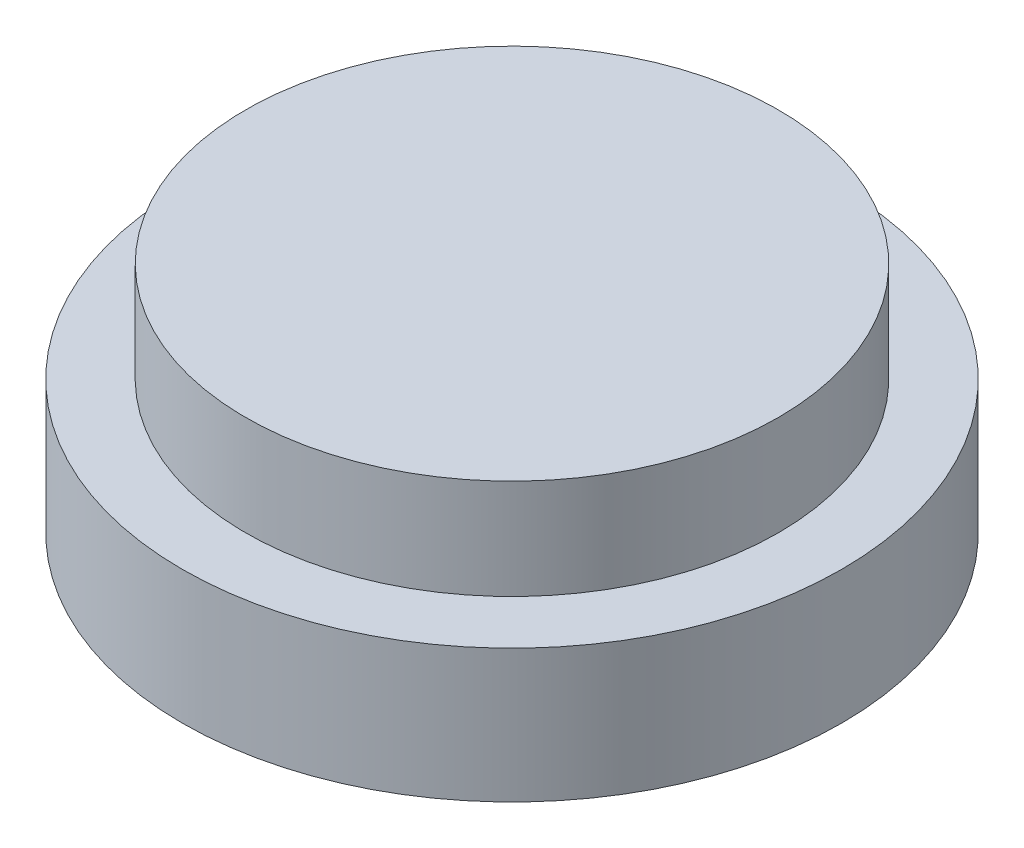
ISO-10303-21;
HEADER;
FILE_DESCRIPTION(('STEP AP214'),'2;1');
FILE_NAME('part.step','',(''),(''),'','','');
FILE_SCHEMA(('AUTOMOTIVE_DESIGN { 1 0 10303 214 1 1 1 1 }'));
ENDSEC;
DATA;
#1=APPLICATION_CONTEXT('core data for automotive mechanical design processes');
#2=APPLICATION_PROTOCOL_DEFINITION('international standard','automotive_design',2000,#1);
#3=PRODUCT_CONTEXT('',#1,'mechanical');
#4=PRODUCT('Part','Part','',(#3));
#5=PRODUCT_RELATED_PRODUCT_CATEGORY('part','',(#4));
#6=PRODUCT_DEFINITION_FORMATION('','',#4);
#7=PRODUCT_DEFINITION_CONTEXT('part definition',#1,'design');
#8=PRODUCT_DEFINITION('design','',#6,#7);
#9=PRODUCT_DEFINITION_SHAPE('','',#8);
#10=(LENGTH_UNIT() NAMED_UNIT(*) SI_UNIT(.MILLI.,.METRE.));
#11=(NAMED_UNIT(*) PLANE_ANGLE_UNIT() SI_UNIT($,.RADIAN.));
#12=(NAMED_UNIT(*) SI_UNIT($,.STERADIAN.) SOLID_ANGLE_UNIT());
#13=UNCERTAINTY_MEASURE_WITH_UNIT(LENGTH_MEASURE(1.E-05),#10,'distance_accuracy_value','');
#14=(GEOMETRIC_REPRESENTATION_CONTEXT(3) GLOBAL_UNCERTAINTY_ASSIGNED_CONTEXT((#13)) GLOBAL_UNIT_ASSIGNED_CONTEXT((#10,
#11,#12)) REPRESENTATION_CONTEXT('',''));
#15=CARTESIAN_POINT('',(0.,0.,0.));
#16=DIRECTION('',(0.,0.,1.));
#17=DIRECTION('',(1.,0.,0.));
#18=AXIS2_PLACEMENT_3D('',#15,#16,#17);
#19=CARTESIAN_POINT('',(0.,63.5,0.));
#20=DIRECTION('',(0.,1.,0.));
#21=DIRECTION('',(-1.,0.,0.));
#22=AXIS2_PLACEMENT_3D('',#19,#20,#21);
#23=PLANE('',#22);
#24=CARTESIAN_POINT('',(0.,63.5,0.));
#25=DIRECTION('',(0.,-1.,0.));
#26=DIRECTION('',(1.,0.,0.));
#27=AXIS2_PLACEMENT_3D('',#24,#25,#26);
#28=CIRCLE('',#27,101.6);
#29=CARTESIAN_POINT('',(101.6,63.5,0.));
#30=VERTEX_POINT('',#29);
#31=EDGE_CURVE('E10',#30,#30,#28,.T.);
#32=ORIENTED_EDGE('',*,*,#31,.F.);
#33=EDGE_LOOP('',(#32));
#34=FACE_BOUND('',#33,.T.);
#35=ADVANCED_FACE('F34',(#34),#23,.T.);
#36=CARTESIAN_POINT('',(0.,0.,0.));
#37=DIRECTION('',(0.,-1.,0.));
#38=DIRECTION('',(1.,0.,0.));
#39=AXIS2_PLACEMENT_3D('',#36,#37,#38);
#40=CYLINDRICAL_SURFACE('',#39,101.6);
#41=ORIENTED_EDGE('',*,*,#31,.T.);
#42=EDGE_LOOP('',(#41));
#43=FACE_BOUND('',#42,.T.);
#44=CARTESIAN_POINT('',(0.,25.4,0.));
#45=DIRECTION('',(0.,-1.,0.));
#46=DIRECTION('',(1.,0.,0.));
#47=AXIS2_PLACEMENT_3D('',#44,#45,#46);
#48=CIRCLE('',#47,101.6);
#49=CARTESIAN_POINT('',(101.6,25.4,0.));
#50=VERTEX_POINT('',#49);
#51=EDGE_CURVE('E40',#50,#50,#48,.T.);
#52=ORIENTED_EDGE('',*,*,#51,.F.);
#53=EDGE_LOOP('',(#52));
#54=FACE_BOUND('',#53,.T.);
#55=ADVANCED_FACE('F76',(#43,#54),#40,.T.);
#56=CARTESIAN_POINT('',(101.6,25.4,0.));
#57=DIRECTION('',(0.,1.,0.));
#58=DIRECTION('',(-1.,0.,0.));
#59=AXIS2_PLACEMENT_3D('',#56,#57,#58);
#60=PLANE('',#59);
#61=ORIENTED_EDGE('',*,*,#51,.T.);
#62=EDGE_LOOP('',(#61));
#63=FACE_BOUND('',#62,.T.);
#64=CARTESIAN_POINT('',(0.,25.4,0.));
#65=DIRECTION('',(0.,-1.,0.));
#66=DIRECTION('',(1.,0.,0.));
#67=AXIS2_PLACEMENT_3D('',#64,#65,#66);
#68=CIRCLE('',#67,125.73);
#69=CARTESIAN_POINT('',(125.73,25.4,0.));
#70=VERTEX_POINT('',#69);
#71=EDGE_CURVE('E44',#70,#70,#68,.T.);
#72=ORIENTED_EDGE('',*,*,#71,.F.);
#73=EDGE_LOOP('',(#72));
#74=FACE_BOUND('',#73,.T.);
#75=ADVANCED_FACE('F81',(#63,#74),#60,.T.);
#76=CARTESIAN_POINT('',(0.,0.,0.));
#77=DIRECTION('',(0.,-1.,0.));
#78=DIRECTION('',(1.,0.,0.));
#79=AXIS2_PLACEMENT_3D('',#76,#77,#78);
#80=CYLINDRICAL_SURFACE('',#79,125.73);
#81=ORIENTED_EDGE('',*,*,#71,.T.);
#82=EDGE_LOOP('',(#81));
#83=FACE_BOUND('',#82,.T.);
#84=CARTESIAN_POINT('',(0.,-25.4,0.));
#85=DIRECTION('',(0.,-1.,0.));
#86=DIRECTION('',(1.,0.,0.));
#87=AXIS2_PLACEMENT_3D('',#84,#85,#86);
#88=CIRCLE('',#87,125.73);
#89=CARTESIAN_POINT('',(125.73,-25.4,0.));
#90=VERTEX_POINT('',#89);
#91=EDGE_CURVE('E48',#90,#90,#88,.T.);
#92=ORIENTED_EDGE('',*,*,#91,.F.);
#93=EDGE_LOOP('',(#92));
#94=FACE_BOUND('',#93,.T.);
#95=ADVANCED_FACE('F72',(#83,#94),#80,.T.);
#96=CARTESIAN_POINT('',(125.73,-25.4,0.));
#97=DIRECTION('',(0.,-1.,0.));
#98=DIRECTION('',(1.,0.,0.));
#99=AXIS2_PLACEMENT_3D('',#96,#97,#98);
#100=PLANE('',#99);
#101=ORIENTED_EDGE('',*,*,#91,.T.);
#102=EDGE_LOOP('',(#101));
#103=FACE_BOUND('',#102,.T.);
#104=CARTESIAN_POINT('',(0.,-25.4,0.));
#105=DIRECTION('',(0.,-1.,0.));
#106=DIRECTION('',(1.,0.,0.));
#107=AXIS2_PLACEMENT_3D('',#104,#105,#106);
#108=CIRCLE('',#107,78.74);
#109=CARTESIAN_POINT('',(78.74,-25.4,0.));
#110=VERTEX_POINT('',#109);
#111=EDGE_CURVE('E53',#110,#110,#108,.T.);
#112=ORIENTED_EDGE('',*,*,#111,.F.);
#113=EDGE_LOOP('',(#112));
#114=FACE_BOUND('',#113,.T.);
#115=ADVANCED_FACE('F64',(#103,#114),#100,.T.);
#116=CARTESIAN_POINT('',(0.,0.,0.));
#117=DIRECTION('',(0.,-1.,0.));
#118=DIRECTION('',(1.,0.,0.));
#119=AXIS2_PLACEMENT_3D('',#116,#117,#118);
#120=CYLINDRICAL_SURFACE('',#119,78.74);
#121=ORIENTED_EDGE('',*,*,#111,.T.);
#122=EDGE_LOOP('',(#121));
#123=FACE_BOUND('',#122,.T.);
#124=CARTESIAN_POINT('',(0.,0.,0.));
#125=DIRECTION('',(0.,-1.,0.));
#126=DIRECTION('',(1.,0.,0.));
#127=AXIS2_PLACEMENT_3D('',#124,#125,#126);
#128=CIRCLE('',#127,78.74);
#129=CARTESIAN_POINT('',(78.74,0.,0.));
#130=VERTEX_POINT('',#129);
#131=EDGE_CURVE('E56',#130,#130,#128,.T.);
#132=ORIENTED_EDGE('',*,*,#131,.F.);
#133=EDGE_LOOP('',(#132));
#134=FACE_BOUND('',#133,.T.);
#135=ADVANCED_FACE('F62',(#123,#134),#120,.F.);
#136=CARTESIAN_POINT('',(78.74,0.,0.));
#137=DIRECTION('',(0.,-1.,0.));
#138=DIRECTION('',(1.,0.,0.));
#139=AXIS2_PLACEMENT_3D('',#136,#137,#138);
#140=PLANE('',#139);
#141=ORIENTED_EDGE('',*,*,#131,.T.);
#142=EDGE_LOOP('',(#141));
#143=FACE_BOUND('',#142,.T.);
#144=ADVANCED_FACE('F60',(#143),#140,.T.);
#145=CLOSED_SHELL('',(#35,#55,#75,#95,#115,#135,#144));
#146=MANIFOLD_SOLID_BREP('B2',#145);
#147=ADVANCED_BREP_SHAPE_REPRESENTATION('',(#18,#146),#14);
#148=SHAPE_DEFINITION_REPRESENTATION(#9,#147);
ENDSEC;
END-ISO-10303-21;
